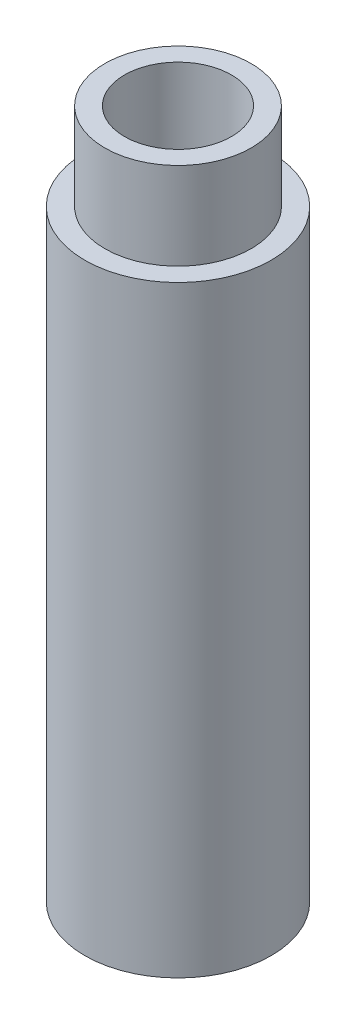
ISO-10303-21;
HEADER;
FILE_DESCRIPTION(('STEP AP214'),'2;1');
FILE_NAME('part.step','',(''),(''),'','','');
FILE_SCHEMA(('AUTOMOTIVE_DESIGN { 1 0 10303 214 1 1 1 1 }'));
ENDSEC;
DATA;
#1=APPLICATION_CONTEXT('core data for automotive mechanical design processes');
#2=APPLICATION_PROTOCOL_DEFINITION('international standard','automotive_design',2000,#1);
#3=PRODUCT_CONTEXT('',#1,'mechanical');
#4=PRODUCT('Part','Part','',(#3));
#5=PRODUCT_RELATED_PRODUCT_CATEGORY('part','',(#4));
#6=PRODUCT_DEFINITION_FORMATION('','',#4);
#7=PRODUCT_DEFINITION_CONTEXT('part definition',#1,'design');
#8=PRODUCT_DEFINITION('design','',#6,#7);
#9=PRODUCT_DEFINITION_SHAPE('','',#8);
#10=(LENGTH_UNIT() NAMED_UNIT(*) SI_UNIT(.MILLI.,.METRE.));
#11=(NAMED_UNIT(*) PLANE_ANGLE_UNIT() SI_UNIT($,.RADIAN.));
#12=(NAMED_UNIT(*) SI_UNIT($,.STERADIAN.) SOLID_ANGLE_UNIT());
#13=UNCERTAINTY_MEASURE_WITH_UNIT(LENGTH_MEASURE(1.E-05),#10,'distance_accuracy_value','');
#14=(GEOMETRIC_REPRESENTATION_CONTEXT(3) GLOBAL_UNCERTAINTY_ASSIGNED_CONTEXT((#13)) GLOBAL_UNIT_ASSIGNED_CONTEXT((#10,
#11,#12)) REPRESENTATION_CONTEXT('',''));
#15=CARTESIAN_POINT('',(0.,0.,0.));
#16=DIRECTION('',(0.,0.,1.));
#17=DIRECTION('',(1.,0.,0.));
#18=AXIS2_PLACEMENT_3D('',#15,#16,#17);
#19=CARTESIAN_POINT('',(0.,61.25,0.));
#20=DIRECTION('',(0.,-1.,0.));
#21=DIRECTION('',(0.,0.,-1.));
#22=AXIS2_PLACEMENT_3D('',#19,#20,#21);
#23=CYLINDRICAL_SURFACE('',#22,8.275);
#24=CARTESIAN_POINT('',(0.,0.,0.));
#25=DIRECTION('',(0.,1.,0.));
#26=DIRECTION('',(0.,0.,1.));
#27=AXIS2_PLACEMENT_3D('',#24,#25,#26);
#28=CIRCLE('',#27,8.275);
#29=CARTESIAN_POINT('',(0.,0.,8.275));
#30=VERTEX_POINT('',#29);
#31=EDGE_CURVE('E12',#30,#30,#28,.T.);
#32=ORIENTED_EDGE('',*,*,#31,.T.);
#33=EDGE_LOOP('',(#32));
#34=FACE_BOUND('',#33,.T.);
#35=CARTESIAN_POINT('',(0.,53.5,0.));
#36=DIRECTION('',(0.,1.,0.));
#37=DIRECTION('',(0.,0.,1.));
#38=AXIS2_PLACEMENT_3D('',#35,#36,#37);
#39=CIRCLE('',#38,8.275);
#40=CARTESIAN_POINT('',(0.,53.5,8.275));
#41=VERTEX_POINT('',#40);
#42=EDGE_CURVE('E58',#41,#41,#39,.T.);
#43=ORIENTED_EDGE('',*,*,#42,.F.);
#44=EDGE_LOOP('',(#43));
#45=FACE_BOUND('',#44,.T.);
#46=ADVANCED_FACE('F51',(#34,#45),#23,.T.);
#47=CARTESIAN_POINT('',(0.,0.,0.));
#48=DIRECTION('',(0.,1.,0.));
#49=DIRECTION('',(0.,0.,1.));
#50=AXIS2_PLACEMENT_3D('',#47,#48,#49);
#51=PLANE('',#50);
#52=ORIENTED_EDGE('',*,*,#31,.F.);
#53=EDGE_LOOP('',(#52));
#54=FACE_BOUND('',#53,.T.);
#55=ADVANCED_FACE('F98',(#54),#51,.F.);
#56=CARTESIAN_POINT('',(0.,53.5,0.));
#57=DIRECTION('',(0.,1.,0.));
#58=DIRECTION('',(0.,0.,1.));
#59=AXIS2_PLACEMENT_3D('',#56,#57,#58);
#60=CYLINDRICAL_SURFACE('',#59,6.5);
#61=CARTESIAN_POINT('',(0.,53.5,0.));
#62=DIRECTION('',(0.,1.,0.));
#63=DIRECTION('',(0.,0.,1.));
#64=AXIS2_PLACEMENT_3D('',#61,#62,#63);
#65=CIRCLE('',#64,6.5);
#66=CARTESIAN_POINT('',(0.,53.5,6.5));
#67=VERTEX_POINT('',#66);
#68=EDGE_CURVE('E63',#67,#67,#65,.T.);
#69=ORIENTED_EDGE('',*,*,#68,.T.);
#70=EDGE_LOOP('',(#69));
#71=FACE_BOUND('',#70,.T.);
#72=CARTESIAN_POINT('',(0.,61.25,0.));
#73=DIRECTION('',(0.,1.,0.));
#74=DIRECTION('',(0.,0.,1.));
#75=AXIS2_PLACEMENT_3D('',#72,#73,#74);
#76=CIRCLE('',#75,6.5);
#77=CARTESIAN_POINT('',(0.,61.25,6.5));
#78=VERTEX_POINT('',#77);
#79=EDGE_CURVE('E69',#78,#78,#76,.T.);
#80=ORIENTED_EDGE('',*,*,#79,.F.);
#81=EDGE_LOOP('',(#80));
#82=FACE_BOUND('',#81,.T.);
#83=ADVANCED_FACE('F102',(#71,#82),#60,.T.);
#84=CARTESIAN_POINT('',(0.,53.5,0.));
#85=DIRECTION('',(0.,1.,0.));
#86=DIRECTION('',(0.,0.,1.));
#87=AXIS2_PLACEMENT_3D('',#84,#85,#86);
#88=PLANE('',#87);
#89=ORIENTED_EDGE('',*,*,#68,.F.);
#90=EDGE_LOOP('',(#89));
#91=FACE_BOUND('',#90,.T.);
#92=ORIENTED_EDGE('',*,*,#42,.T.);
#93=EDGE_LOOP('',(#92));
#94=FACE_BOUND('',#93,.T.);
#95=ADVANCED_FACE('F108',(#91,#94),#88,.T.);
#96=CARTESIAN_POINT('',(0.,61.25,0.));
#97=DIRECTION('',(0.,1.,0.));
#98=DIRECTION('',(0.,0.,1.));
#99=AXIS2_PLACEMENT_3D('',#96,#97,#98);
#100=PLANE('',#99);
#101=CARTESIAN_POINT('',(0.,61.25,0.));
#102=DIRECTION('',(0.,1.,0.));
#103=DIRECTION('',(0.,0.,1.));
#104=AXIS2_PLACEMENT_3D('',#101,#102,#103);
#105=CIRCLE('',#104,4.75);
#106=CARTESIAN_POINT('',(0.,61.25,4.75));
#107=VERTEX_POINT('',#106);
#108=EDGE_CURVE('E74',#107,#107,#105,.T.);
#109=ORIENTED_EDGE('',*,*,#108,.F.);
#110=EDGE_LOOP('',(#109));
#111=FACE_BOUND('',#110,.T.);
#112=ORIENTED_EDGE('',*,*,#79,.T.);
#113=EDGE_LOOP('',(#112));
#114=FACE_BOUND('',#113,.T.);
#115=ADVANCED_FACE('F95',(#111,#114),#100,.T.);
#116=CARTESIAN_POINT('',(0.,53.5,0.));
#117=DIRECTION('',(0.,1.,0.));
#118=DIRECTION('',(0.,0.,1.));
#119=AXIS2_PLACEMENT_3D('',#116,#117,#118);
#120=CYLINDRICAL_SURFACE('',#119,4.75);
#121=ORIENTED_EDGE('',*,*,#108,.T.);
#122=EDGE_LOOP('',(#121));
#123=FACE_BOUND('',#122,.T.);
#124=CARTESIAN_POINT('',(0.,2.,0.));
#125=DIRECTION('',(0.,1.,0.));
#126=DIRECTION('',(0.,0.,1.));
#127=AXIS2_PLACEMENT_3D('',#124,#125,#126);
#128=CIRCLE('',#127,4.75);
#129=CARTESIAN_POINT('',(0.,2.,4.75));
#130=VERTEX_POINT('',#129);
#131=EDGE_CURVE('E79',#130,#130,#128,.F.);
#132=ORIENTED_EDGE('',*,*,#131,.T.);
#133=EDGE_LOOP('',(#132));
#134=FACE_BOUND('',#133,.T.);
#135=ADVANCED_FACE('F87',(#123,#134),#120,.F.);
#136=CARTESIAN_POINT('',(0.,2.,0.));
#137=DIRECTION('',(0.,1.,0.));
#138=DIRECTION('',(0.,0.,1.));
#139=AXIS2_PLACEMENT_3D('',#136,#137,#138);
#140=PLANE('',#139);
#141=ORIENTED_EDGE('',*,*,#131,.F.);
#142=EDGE_LOOP('',(#141));
#143=FACE_BOUND('',#142,.T.);
#144=ADVANCED_FACE('F89',(#143),#140,.T.);
#145=CLOSED_SHELL('',(#46,#55,#83,#95,#115,#135,#144));
#146=MANIFOLD_SOLID_BREP('B2',#145);
#147=ADVANCED_BREP_SHAPE_REPRESENTATION('',(#18,#146),#14);
#148=SHAPE_DEFINITION_REPRESENTATION(#9,#147);
ENDSEC;
END-ISO-10303-21;
